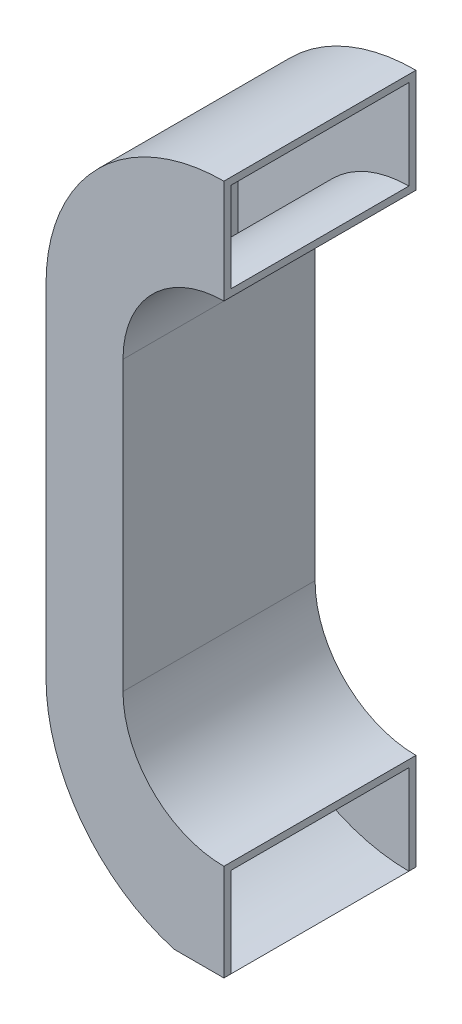
ISO-10303-21;
HEADER;
FILE_DESCRIPTION(('STEP AP214'),'2;1');
FILE_NAME('part.step','',(''),(''),'','','');
FILE_SCHEMA(('AUTOMOTIVE_DESIGN { 1 0 10303 214 1 1 1 1 }'));
ENDSEC;
DATA;
#1=APPLICATION_CONTEXT('core data for automotive mechanical design processes');
#2=APPLICATION_PROTOCOL_DEFINITION('international standard','automotive_design',2000,#1);
#3=PRODUCT_CONTEXT('',#1,'mechanical');
#4=PRODUCT('Part','Part','',(#3));
#5=PRODUCT_RELATED_PRODUCT_CATEGORY('part','',(#4));
#6=PRODUCT_DEFINITION_FORMATION('','',#4);
#7=PRODUCT_DEFINITION_CONTEXT('part definition',#1,'design');
#8=PRODUCT_DEFINITION('design','',#6,#7);
#9=PRODUCT_DEFINITION_SHAPE('','',#8);
#10=(LENGTH_UNIT() NAMED_UNIT(*) SI_UNIT(.MILLI.,.METRE.));
#11=(NAMED_UNIT(*) PLANE_ANGLE_UNIT() SI_UNIT($,.RADIAN.));
#12=(NAMED_UNIT(*) SI_UNIT($,.STERADIAN.) SOLID_ANGLE_UNIT());
#13=UNCERTAINTY_MEASURE_WITH_UNIT(LENGTH_MEASURE(1.E-05),#10,'distance_accuracy_value','');
#14=(GEOMETRIC_REPRESENTATION_CONTEXT(3) GLOBAL_UNCERTAINTY_ASSIGNED_CONTEXT((#13)) GLOBAL_UNIT_ASSIGNED_CONTEXT((#10,
#11,#12)) REPRESENTATION_CONTEXT('',''));
#15=CARTESIAN_POINT('',(0.,0.,0.));
#16=DIRECTION('',(0.,0.,1.));
#17=DIRECTION('',(1.,0.,0.));
#18=AXIS2_PLACEMENT_3D('',#15,#16,#17);
#19=CARTESIAN_POINT('',(0.,88.2,79.375));
#20=DIRECTION('',(0.,0.,1.));
#21=DIRECTION('',(1.,0.,0.));
#22=AXIS2_PLACEMENT_3D('',#19,#20,#21);
#23=PLANE('',#22);
#24=CARTESIAN_POINT('',(0.,216.6,79.375));
#25=DIRECTION('',(0.,0.,1.));
#26=DIRECTION('',(1.,0.,0.));
#27=AXIS2_PLACEMENT_3D('',#24,#25,#26);
#28=CIRCLE('',#27,48.2);
#29=CARTESIAN_POINT('',(0.,264.8,79.375));
#30=VERTEX_POINT('',#29);
#31=CARTESIAN_POINT('',(-48.2,216.6,79.375));
#32=VERTEX_POINT('',#31);
#33=EDGE_CURVE('E217',#30,#32,#28,.T.);
#34=ORIENTED_EDGE('',*,*,#33,.T.);
#35=DIRECTION('',(0.,1.,0.));
#36=VECTOR('',#35,1.);
#37=CARTESIAN_POINT('',(-48.2,0.,79.375));
#38=LINE('',#37,#36);
#39=CARTESIAN_POINT('',(-48.2,88.2,79.375));
#40=VERTEX_POINT('',#39);
#41=EDGE_CURVE('E220',#40,#32,#38,.T.);
#42=ORIENTED_EDGE('',*,*,#41,.F.);
#43=CARTESIAN_POINT('',(0.,88.2,79.375));
#44=DIRECTION('',(0.,0.,1.));
#45=DIRECTION('',(1.,0.,0.));
#46=AXIS2_PLACEMENT_3D('',#43,#44,#45);
#47=CIRCLE('',#46,48.2);
#48=CARTESIAN_POINT('',(0.,40.,79.375));
#49=VERTEX_POINT('',#48);
#50=EDGE_CURVE('E224',#49,#40,#47,.F.);
#51=ORIENTED_EDGE('',*,*,#50,.F.);
#52=DIRECTION('',(0.,1.,0.));
#53=VECTOR('',#52,1.);
#54=CARTESIAN_POINT('',(0.,43.175,79.375));
#55=LINE('',#54,#53);
#56=CARTESIAN_POINT('',(0.,0.,79.375));
#57=VERTEX_POINT('',#56);
#58=EDGE_CURVE('E251',#57,#49,#55,.T.);
#59=ORIENTED_EDGE('',*,*,#58,.F.);
#60=CARTESIAN_POINT('',(0.,76.2,79.375));
#61=DIRECTION('',(0.,0.,1.));
#62=DIRECTION('',(1.,0.,0.));
#63=AXIS2_PLACEMENT_3D('',#60,#61,#62);
#64=CIRCLE('',#63,76.2);
#65=CARTESIAN_POINT('',(-76.2,76.2,79.375));
#66=VERTEX_POINT('',#65);
#67=EDGE_CURVE('E142',#57,#66,#64,.F.);
#68=ORIENTED_EDGE('',*,*,#67,.T.);
#69=DIRECTION('',(0.,1.,0.));
#70=VECTOR('',#69,1.);
#71=CARTESIAN_POINT('',(-76.2,0.,79.375));
#72=LINE('',#71,#70);
#73=CARTESIAN_POINT('',(-76.2,228.6,79.375));
#74=VERTEX_POINT('',#73);
#75=EDGE_CURVE('E100',#66,#74,#72,.T.);
#76=ORIENTED_EDGE('',*,*,#75,.T.);
#77=CARTESIAN_POINT('',(0.,228.6,79.375));
#78=DIRECTION('',(0.,0.,1.));
#79=DIRECTION('',(1.,0.,0.));
#80=AXIS2_PLACEMENT_3D('',#77,#78,#79);
#81=CIRCLE('',#80,76.2);
#82=CARTESIAN_POINT('',(0.,304.8,79.375));
#83=VERTEX_POINT('',#82);
#84=EDGE_CURVE('E124',#83,#74,#81,.T.);
#85=ORIENTED_EDGE('',*,*,#84,.F.);
#86=DIRECTION('',(0.,1.,0.));
#87=VECTOR('',#86,1.);
#88=CARTESIAN_POINT('',(0.,261.625,79.375));
#89=LINE('',#88,#87);
#90=EDGE_CURVE('E246',#30,#83,#89,.T.);
#91=ORIENTED_EDGE('',*,*,#90,.F.);
#92=EDGE_LOOP('',(#34,#42,#51,#59,#68,#76,#85,#91));
#93=FACE_BOUND('',#92,.T.);
#94=ADVANCED_FACE('F84',(#93),#23,.F.);
#95=CARTESIAN_POINT('',(0.,0.,79.375));
#96=DIRECTION('',(-1.,0.,0.));
#97=DIRECTION('',(0.,-1.,0.));
#98=AXIS2_PLACEMENT_3D('',#95,#96,#97);
#99=PLANE('',#98);
#100=DIRECTION('',(0.,-1.,0.));
#101=VECTOR('',#100,1.);
#102=CARTESIAN_POINT('',(0.,307.975,-3.175));
#103=LINE('',#102,#101);
#104=CARTESIAN_POINT('',(0.,307.975,-3.175));
#105=VERTEX_POINT('',#104);
#106=CARTESIAN_POINT('',(0.,261.625,-3.175));
#107=VERTEX_POINT('',#106);
#108=EDGE_CURVE('E191',#105,#107,#103,.T.);
#109=ORIENTED_EDGE('',*,*,#108,.F.);
#110=DIRECTION('',(0.,0.,-1.));
#111=VECTOR('',#110,1.);
#112=CARTESIAN_POINT('',(0.,307.975,79.375));
#113=LINE('',#112,#111);
#114=CARTESIAN_POINT('',(0.,307.975,82.55));
#115=VERTEX_POINT('',#114);
#116=EDGE_CURVE('E12',#115,#105,#113,.T.);
#117=ORIENTED_EDGE('',*,*,#116,.F.);
#118=DIRECTION('',(0.,1.,0.));
#119=VECTOR('',#118,1.);
#120=CARTESIAN_POINT('',(0.,261.625,82.55));
#121=LINE('',#120,#119);
#122=CARTESIAN_POINT('',(0.,261.625,82.55));
#123=VERTEX_POINT('',#122);
#124=EDGE_CURVE('E257',#123,#115,#121,.T.);
#125=ORIENTED_EDGE('',*,*,#124,.F.);
#126=DIRECTION('',(0.,0.,-1.));
#127=VECTOR('',#126,1.);
#128=CARTESIAN_POINT('',(0.,261.625,82.55));
#129=LINE('',#128,#127);
#130=EDGE_CURVE('E282',#123,#107,#129,.T.);
#131=ORIENTED_EDGE('',*,*,#130,.T.);
#132=EDGE_LOOP('',(#109,#117,#125,#131));
#133=FACE_BOUND('',#132,.T.);
#134=DIRECTION('',(0.,0.,-1.));
#135=VECTOR('',#134,1.);
#136=CARTESIAN_POINT('',(0.,304.8,79.375));
#137=LINE('',#136,#135);
#138=CARTESIAN_POINT('',(0.,304.8,0.));
#139=VERTEX_POINT('',#138);
#140=EDGE_CURVE('E127',#83,#139,#137,.T.);
#141=ORIENTED_EDGE('',*,*,#140,.T.);
#142=DIRECTION('',(0.,-1.,0.));
#143=VECTOR('',#142,1.);
#144=CARTESIAN_POINT('',(0.,307.975,0.));
#145=LINE('',#144,#143);
#146=CARTESIAN_POINT('',(0.,264.8,0.));
#147=VERTEX_POINT('',#146);
#148=EDGE_CURVE('E141',#139,#147,#145,.T.);
#149=ORIENTED_EDGE('',*,*,#148,.T.);
#150=DIRECTION('',(0.,0.,-1.));
#151=VECTOR('',#150,1.);
#152=CARTESIAN_POINT('',(0.,264.8,79.375));
#153=LINE('',#152,#151);
#154=EDGE_CURVE('E243',#30,#147,#153,.T.);
#155=ORIENTED_EDGE('',*,*,#154,.F.);
#156=ORIENTED_EDGE('',*,*,#90,.T.);
#157=EDGE_LOOP('',(#141,#149,#155,#156));
#158=FACE_BOUND('',#157,.T.);
#159=ADVANCED_FACE('F86',(#133,#158),#99,.F.);
#160=CARTESIAN_POINT('',(0.,228.6,79.375));
#161=DIRECTION('',(0.,0.,-1.));
#162=DIRECTION('',(-1.,0.,0.));
#163=AXIS2_PLACEMENT_3D('',#160,#161,#162);
#164=CYLINDRICAL_SURFACE('',#163,79.375);
#165=ORIENTED_EDGE('',*,*,#116,.T.);
#166=CARTESIAN_POINT('',(0.,228.6,-3.175));
#167=DIRECTION('',(0.,0.,-1.));
#168=DIRECTION('',(-1.,0.,0.));
#169=AXIS2_PLACEMENT_3D('',#166,#167,#168);
#170=CIRCLE('',#169,79.375);
#171=CARTESIAN_POINT('',(-79.375,228.6,-3.175));
#172=VERTEX_POINT('',#171);
#173=EDGE_CURVE('E182',#172,#105,#170,.T.);
#174=ORIENTED_EDGE('',*,*,#173,.F.);
#175=DIRECTION('',(0.,0.,-1.));
#176=VECTOR('',#175,1.);
#177=CARTESIAN_POINT('',(-79.375,228.6,79.375));
#178=LINE('',#177,#176);
#179=CARTESIAN_POINT('',(-79.375,228.6,82.55));
#180=VERTEX_POINT('',#179);
#181=EDGE_CURVE('E93',#180,#172,#178,.T.);
#182=ORIENTED_EDGE('',*,*,#181,.F.);
#183=CARTESIAN_POINT('',(0.,228.6,82.55));
#184=DIRECTION('',(0.,0.,1.));
#185=DIRECTION('',(1.,0.,0.));
#186=AXIS2_PLACEMENT_3D('',#183,#184,#185);
#187=CIRCLE('',#186,79.375);
#188=EDGE_CURVE('E260',#115,#180,#187,.T.);
#189=ORIENTED_EDGE('',*,*,#188,.F.);
#190=EDGE_LOOP('',(#165,#174,#182,#189));
#191=FACE_BOUND('',#190,.T.);
#192=ADVANCED_FACE('F188',(#191),#164,.T.);
#193=CARTESIAN_POINT('',(-79.375,0.,79.375));
#194=DIRECTION('',(-1.,0.,0.));
#195=DIRECTION('',(0.,0.,1.));
#196=AXIS2_PLACEMENT_3D('',#193,#194,#195);
#197=PLANE('',#196);
#198=ORIENTED_EDGE('',*,*,#181,.T.);
#199=DIRECTION('',(0.,1.,0.));
#200=VECTOR('',#199,1.);
#201=CARTESIAN_POINT('',(-79.375,76.2,-3.175));
#202=LINE('',#201,#200);
#203=CARTESIAN_POINT('',(-79.375,76.2,-3.175));
#204=VERTEX_POINT('',#203);
#205=EDGE_CURVE('E166',#204,#172,#202,.T.);
#206=ORIENTED_EDGE('',*,*,#205,.F.);
#207=DIRECTION('',(0.,0.,-1.));
#208=VECTOR('',#207,1.);
#209=CARTESIAN_POINT('',(-79.375,76.2,79.375));
#210=LINE('',#209,#208);
#211=CARTESIAN_POINT('',(-79.375,76.2,82.55));
#212=VERTEX_POINT('',#211);
#213=EDGE_CURVE('E154',#212,#204,#210,.T.);
#214=ORIENTED_EDGE('',*,*,#213,.F.);
#215=DIRECTION('',(0.,-1.,0.));
#216=VECTOR('',#215,1.);
#217=CARTESIAN_POINT('',(-79.375,228.6,82.55));
#218=LINE('',#217,#216);
#219=EDGE_CURVE('E169',#180,#212,#218,.T.);
#220=ORIENTED_EDGE('',*,*,#219,.F.);
#221=EDGE_LOOP('',(#198,#206,#214,#220));
#222=FACE_BOUND('',#221,.T.);
#223=ADVANCED_FACE('F163',(#222),#197,.T.);
#224=CARTESIAN_POINT('',(0.,76.2,79.375));
#225=DIRECTION('',(0.,0.,-1.));
#226=DIRECTION('',(-1.,0.,0.));
#227=AXIS2_PLACEMENT_3D('',#224,#225,#226);
#228=CYLINDRICAL_SURFACE('',#227,79.375);
#229=ORIENTED_EDGE('',*,*,#213,.T.);
#230=CARTESIAN_POINT('',(0.,76.2,-3.175));
#231=DIRECTION('',(0.,0.,-1.));
#232=DIRECTION('',(-1.,0.,0.));
#233=AXIS2_PLACEMENT_3D('',#230,#231,#232);
#234=CIRCLE('',#233,79.375);
#235=CARTESIAN_POINT('',(-22.225,0.,-3.175));
#236=VERTEX_POINT('',#235);
#237=EDGE_CURVE('E185',#236,#204,#234,.T.);
#238=ORIENTED_EDGE('',*,*,#237,.F.);
#239=DIRECTION('',(0.,0.,-1.));
#240=VECTOR('',#239,1.);
#241=CARTESIAN_POINT('',(-22.225,0.,79.375));
#242=LINE('',#241,#240);
#243=CARTESIAN_POINT('',(-22.225,0.,82.55));
#244=VERTEX_POINT('',#243);
#245=EDGE_CURVE('E151',#244,#236,#242,.T.);
#246=ORIENTED_EDGE('',*,*,#245,.F.);
#247=CARTESIAN_POINT('',(0.,76.2,82.55));
#248=DIRECTION('',(0.,0.,1.));
#249=DIRECTION('',(1.,0.,0.));
#250=AXIS2_PLACEMENT_3D('',#247,#248,#249);
#251=CIRCLE('',#250,79.375);
#252=EDGE_CURVE('E263',#212,#244,#251,.T.);
#253=ORIENTED_EDGE('',*,*,#252,.F.);
#254=EDGE_LOOP('',(#229,#238,#246,#253));
#255=FACE_BOUND('',#254,.T.);
#256=ADVANCED_FACE('F315',(#255),#228,.T.);
#257=CARTESIAN_POINT('',(0.,0.,79.375));
#258=DIRECTION('',(0.,-1.,0.));
#259=DIRECTION('',(0.,0.,-1.));
#260=AXIS2_PLACEMENT_3D('',#257,#258,#259);
#261=PLANE('',#260);
#262=ORIENTED_EDGE('',*,*,#245,.T.);
#263=DIRECTION('',(-1.,0.,0.));
#264=VECTOR('',#263,1.);
#265=CARTESIAN_POINT('',(0.,0.,-3.175));
#266=LINE('',#265,#264);
#267=CARTESIAN_POINT('',(0.,0.,-3.175));
#268=VERTEX_POINT('',#267);
#269=EDGE_CURVE('E210',#268,#236,#266,.T.);
#270=ORIENTED_EDGE('',*,*,#269,.F.);
#271=DIRECTION('',(0.,0.,1.));
#272=VECTOR('',#271,1.);
#273=CARTESIAN_POINT('',(0.,0.,-3.175));
#274=LINE('',#273,#272);
#275=CARTESIAN_POINT('',(0.,0.,0.));
#276=VERTEX_POINT('',#275);
#277=EDGE_CURVE('E186',#268,#276,#274,.T.);
#278=ORIENTED_EDGE('',*,*,#277,.T.);
#279=DIRECTION('',(0.,0.,-1.));
#280=VECTOR('',#279,1.);
#281=CARTESIAN_POINT('',(0.,0.,79.375));
#282=LINE('',#281,#280);
#283=EDGE_CURVE('E149',#57,#276,#282,.T.);
#284=ORIENTED_EDGE('',*,*,#283,.F.);
#285=DIRECTION('',(0.,0.,-1.));
#286=VECTOR('',#285,1.);
#287=CARTESIAN_POINT('',(0.,0.,82.55));
#288=LINE('',#287,#286);
#289=CARTESIAN_POINT('',(0.,0.,82.55));
#290=VERTEX_POINT('',#289);
#291=EDGE_CURVE('E279',#290,#57,#288,.T.);
#292=ORIENTED_EDGE('',*,*,#291,.F.);
#293=DIRECTION('',(1.,0.,0.));
#294=VECTOR('',#293,1.);
#295=CARTESIAN_POINT('',(0.,0.,82.55));
#296=LINE('',#295,#294);
#297=EDGE_CURVE('E266',#244,#290,#296,.T.);
#298=ORIENTED_EDGE('',*,*,#297,.F.);
#299=EDGE_LOOP('',(#262,#270,#278,#284,#292,#298));
#300=FACE_BOUND('',#299,.T.);
#301=ADVANCED_FACE('F305',(#300),#261,.T.);
#302=CARTESIAN_POINT('',(0.,76.2,79.375));
#303=DIRECTION('',(0.,0.,-1.));
#304=DIRECTION('',(-1.,0.,0.));
#305=AXIS2_PLACEMENT_3D('',#302,#303,#304);
#306=CYLINDRICAL_SURFACE('',#305,76.2);
#307=CARTESIAN_POINT('',(0.,76.2,0.));
#308=DIRECTION('',(0.,0.,1.));
#309=DIRECTION('',(1.,0.,0.));
#310=AXIS2_PLACEMENT_3D('',#307,#308,#309);
#311=CIRCLE('',#310,76.2);
#312=CARTESIAN_POINT('',(-76.2,76.2,0.));
#313=VERTEX_POINT('',#312);
#314=EDGE_CURVE('E136',#276,#313,#311,.F.);
#315=ORIENTED_EDGE('',*,*,#314,.T.);
#316=DIRECTION('',(0.,0.,-1.));
#317=VECTOR('',#316,1.);
#318=CARTESIAN_POINT('',(-76.2,76.2,79.375));
#319=LINE('',#318,#317);
#320=EDGE_CURVE('E126',#66,#313,#319,.T.);
#321=ORIENTED_EDGE('',*,*,#320,.F.);
#322=ORIENTED_EDGE('',*,*,#67,.F.);
#323=ORIENTED_EDGE('',*,*,#283,.T.);
#324=EDGE_LOOP('',(#315,#321,#322,#323));
#325=FACE_BOUND('',#324,.T.);
#326=ADVANCED_FACE('F293',(#325),#306,.F.);
#327=CARTESIAN_POINT('',(-76.2,0.,79.375));
#328=DIRECTION('',(-1.,0.,0.));
#329=DIRECTION('',(0.,0.,1.));
#330=AXIS2_PLACEMENT_3D('',#327,#328,#329);
#331=PLANE('',#330);
#332=DIRECTION('',(0.,1.,0.));
#333=VECTOR('',#332,1.);
#334=CARTESIAN_POINT('',(-76.2,0.,0.));
#335=LINE('',#334,#333);
#336=CARTESIAN_POINT('',(-76.2,228.6,0.));
#337=VERTEX_POINT('',#336);
#338=EDGE_CURVE('E131',#313,#337,#335,.T.);
#339=ORIENTED_EDGE('',*,*,#338,.T.);
#340=DIRECTION('',(0.,0.,-1.));
#341=VECTOR('',#340,1.);
#342=CARTESIAN_POINT('',(-76.2,228.6,79.375));
#343=LINE('',#342,#341);
#344=EDGE_CURVE('E117',#74,#337,#343,.T.);
#345=ORIENTED_EDGE('',*,*,#344,.F.);
#346=ORIENTED_EDGE('',*,*,#75,.F.);
#347=ORIENTED_EDGE('',*,*,#320,.T.);
#348=EDGE_LOOP('',(#339,#345,#346,#347));
#349=FACE_BOUND('',#348,.T.);
#350=ADVANCED_FACE('F132',(#349),#331,.F.);
#351=CARTESIAN_POINT('',(0.,228.6,79.375));
#352=DIRECTION('',(0.,0.,-1.));
#353=DIRECTION('',(-1.,0.,0.));
#354=AXIS2_PLACEMENT_3D('',#351,#352,#353);
#355=CYLINDRICAL_SURFACE('',#354,76.2);
#356=CARTESIAN_POINT('',(0.,228.6,0.));
#357=DIRECTION('',(0.,0.,1.));
#358=DIRECTION('',(1.,0.,0.));
#359=AXIS2_PLACEMENT_3D('',#356,#357,#358);
#360=CIRCLE('',#359,76.2);
#361=EDGE_CURVE('E122',#139,#337,#360,.T.);
#362=ORIENTED_EDGE('',*,*,#361,.F.);
#363=ORIENTED_EDGE('',*,*,#140,.F.);
#364=ORIENTED_EDGE('',*,*,#84,.T.);
#365=ORIENTED_EDGE('',*,*,#344,.T.);
#366=EDGE_LOOP('',(#362,#363,#364,#365));
#367=FACE_BOUND('',#366,.T.);
#368=ADVANCED_FACE('F119',(#367),#355,.F.);
#369=CARTESIAN_POINT('',(0.,88.2,82.55));
#370=DIRECTION('',(0.,0.,-1.));
#371=DIRECTION('',(-1.,0.,0.));
#372=AXIS2_PLACEMENT_3D('',#369,#370,#371);
#373=CYLINDRICAL_SURFACE('',#372,45.025);
#374=DIRECTION('',(0.,0.,-1.));
#375=VECTOR('',#374,1.);
#376=CARTESIAN_POINT('',(0.,43.175,82.55));
#377=LINE('',#376,#375);
#378=CARTESIAN_POINT('',(0.,43.175,82.55));
#379=VERTEX_POINT('',#378);
#380=CARTESIAN_POINT('',(0.,43.175,-3.175));
#381=VERTEX_POINT('',#380);
#382=EDGE_CURVE('E272',#379,#381,#377,.T.);
#383=ORIENTED_EDGE('',*,*,#382,.T.);
#384=CARTESIAN_POINT('',(0.,88.2,-3.175));
#385=DIRECTION('',(0.,0.,1.));
#386=DIRECTION('',(-1.,0.,0.));
#387=AXIS2_PLACEMENT_3D('',#384,#385,#386);
#388=CIRCLE('',#387,45.025);
#389=CARTESIAN_POINT('',(-45.025,88.2,-3.175));
#390=VERTEX_POINT('',#389);
#391=EDGE_CURVE('E204',#390,#381,#388,.T.);
#392=ORIENTED_EDGE('',*,*,#391,.F.);
#393=DIRECTION('',(0.,0.,-1.));
#394=VECTOR('',#393,1.);
#395=CARTESIAN_POINT('',(-45.025,88.2,82.55));
#396=LINE('',#395,#394);
#397=CARTESIAN_POINT('',(-45.025,88.2,82.55));
#398=VERTEX_POINT('',#397);
#399=EDGE_CURVE('E288',#398,#390,#396,.T.);
#400=ORIENTED_EDGE('',*,*,#399,.F.);
#401=CARTESIAN_POINT('',(0.,88.2,82.55));
#402=DIRECTION('',(0.,0.,-1.));
#403=DIRECTION('',(1.,0.,0.));
#404=AXIS2_PLACEMENT_3D('',#401,#402,#403);
#405=CIRCLE('',#404,45.025);
#406=EDGE_CURVE('E247',#379,#398,#405,.T.);
#407=ORIENTED_EDGE('',*,*,#406,.F.);
#408=EDGE_LOOP('',(#383,#392,#400,#407));
#409=FACE_BOUND('',#408,.T.);
#410=ADVANCED_FACE('F393',(#409),#373,.F.);
#411=CARTESIAN_POINT('',(-45.025,88.2,82.55));
#412=DIRECTION('',(-1.,0.,0.));
#413=DIRECTION('',(0.,0.,1.));
#414=AXIS2_PLACEMENT_3D('',#411,#412,#413);
#415=PLANE('',#414);
#416=ORIENTED_EDGE('',*,*,#399,.T.);
#417=DIRECTION('',(0.,-1.,0.));
#418=VECTOR('',#417,1.);
#419=CARTESIAN_POINT('',(-45.025,216.6,-3.175));
#420=LINE('',#419,#418);
#421=CARTESIAN_POINT('',(-45.025,216.6,-3.175));
#422=VERTEX_POINT('',#421);
#423=EDGE_CURVE('E201',#422,#390,#420,.T.);
#424=ORIENTED_EDGE('',*,*,#423,.F.);
#425=DIRECTION('',(0.,0.,-1.));
#426=VECTOR('',#425,1.);
#427=CARTESIAN_POINT('',(-45.025,216.6,82.55));
#428=LINE('',#427,#426);
#429=CARTESIAN_POINT('',(-45.025,216.6,82.55));
#430=VERTEX_POINT('',#429);
#431=EDGE_CURVE('E285',#430,#422,#428,.T.);
#432=ORIENTED_EDGE('',*,*,#431,.F.);
#433=DIRECTION('',(0.,1.,0.));
#434=VECTOR('',#433,1.);
#435=CARTESIAN_POINT('',(-45.025,88.2,82.55));
#436=LINE('',#435,#434);
#437=EDGE_CURVE('E250',#398,#430,#436,.T.);
#438=ORIENTED_EDGE('',*,*,#437,.F.);
#439=EDGE_LOOP('',(#416,#424,#432,#438));
#440=FACE_BOUND('',#439,.T.);
#441=ADVANCED_FACE('F372',(#440),#415,.F.);
#442=CARTESIAN_POINT('',(0.,216.6,82.55));
#443=DIRECTION('',(0.,0.,-1.));
#444=DIRECTION('',(-1.,0.,0.));
#445=AXIS2_PLACEMENT_3D('',#442,#443,#444);
#446=CYLINDRICAL_SURFACE('',#445,45.025);
#447=ORIENTED_EDGE('',*,*,#431,.T.);
#448=CARTESIAN_POINT('',(0.,216.6,-3.175));
#449=DIRECTION('',(0.,0.,1.));
#450=DIRECTION('',(-1.,0.,0.));
#451=AXIS2_PLACEMENT_3D('',#448,#449,#450);
#452=CIRCLE('',#451,45.025);
#453=EDGE_CURVE('E194',#107,#422,#452,.T.);
#454=ORIENTED_EDGE('',*,*,#453,.F.);
#455=ORIENTED_EDGE('',*,*,#130,.F.);
#456=CARTESIAN_POINT('',(0.,216.6,82.55));
#457=DIRECTION('',(0.,0.,-1.));
#458=DIRECTION('',(1.,0.,0.));
#459=AXIS2_PLACEMENT_3D('',#456,#457,#458);
#460=CIRCLE('',#459,45.025);
#461=EDGE_CURVE('E254',#430,#123,#460,.T.);
#462=ORIENTED_EDGE('',*,*,#461,.F.);
#463=EDGE_LOOP('',(#447,#454,#455,#462));
#464=FACE_BOUND('',#463,.T.);
#465=ADVANCED_FACE('F376',(#464),#446,.F.);
#466=CARTESIAN_POINT('',(0.,43.175,82.55));
#467=DIRECTION('',(-1.,0.,0.));
#468=DIRECTION('',(0.,0.,1.));
#469=AXIS2_PLACEMENT_3D('',#466,#467,#468);
#470=PLANE('',#469);
#471=ORIENTED_EDGE('',*,*,#58,.T.);
#472=DIRECTION('',(0.,0.,-1.));
#473=VECTOR('',#472,1.);
#474=CARTESIAN_POINT('',(0.,40.,79.375));
#475=LINE('',#474,#473);
#476=CARTESIAN_POINT('',(0.,40.,0.));
#477=VERTEX_POINT('',#476);
#478=EDGE_CURVE('E227',#49,#477,#475,.T.);
#479=ORIENTED_EDGE('',*,*,#478,.T.);
#480=DIRECTION('',(0.,-1.,0.));
#481=VECTOR('',#480,1.);
#482=CARTESIAN_POINT('',(0.,43.175,0.));
#483=LINE('',#482,#481);
#484=EDGE_CURVE('E192',#477,#276,#483,.T.);
#485=ORIENTED_EDGE('',*,*,#484,.T.);
#486=ORIENTED_EDGE('',*,*,#277,.F.);
#487=DIRECTION('',(0.,-1.,0.));
#488=VECTOR('',#487,1.);
#489=CARTESIAN_POINT('',(0.,43.175,-3.175));
#490=LINE('',#489,#488);
#491=EDGE_CURVE('E207',#381,#268,#490,.T.);
#492=ORIENTED_EDGE('',*,*,#491,.F.);
#493=ORIENTED_EDGE('',*,*,#382,.F.);
#494=DIRECTION('',(0.,1.,0.));
#495=VECTOR('',#494,1.);
#496=CARTESIAN_POINT('',(0.,43.175,82.55));
#497=LINE('',#496,#495);
#498=EDGE_CURVE('E269',#290,#379,#497,.T.);
#499=ORIENTED_EDGE('',*,*,#498,.F.);
#500=ORIENTED_EDGE('',*,*,#291,.T.);
#501=EDGE_LOOP('',(#471,#479,#485,#486,#492,#493,#499,#500));
#502=FACE_BOUND('',#501,.T.);
#503=ADVANCED_FACE('F299',(#502),#470,.F.);
#504=CARTESIAN_POINT('',(0.,88.2,82.55));
#505=DIRECTION('',(0.,0.,1.));
#506=DIRECTION('',(1.,0.,0.));
#507=AXIS2_PLACEMENT_3D('',#504,#505,#506);
#508=PLANE('',#507);
#509=ORIENTED_EDGE('',*,*,#406,.T.);
#510=ORIENTED_EDGE('',*,*,#437,.T.);
#511=ORIENTED_EDGE('',*,*,#461,.T.);
#512=ORIENTED_EDGE('',*,*,#124,.T.);
#513=ORIENTED_EDGE('',*,*,#188,.T.);
#514=ORIENTED_EDGE('',*,*,#219,.T.);
#515=ORIENTED_EDGE('',*,*,#252,.T.);
#516=ORIENTED_EDGE('',*,*,#297,.T.);
#517=ORIENTED_EDGE('',*,*,#498,.T.);
#518=EDGE_LOOP('',(#509,#510,#511,#512,#513,#514,#515,#516,#517));
#519=FACE_BOUND('',#518,.T.);
#520=ADVANCED_FACE('F322',(#519),#508,.T.);
#521=CARTESIAN_POINT('',(0.,216.6,79.375));
#522=DIRECTION('',(0.,0.,-1.));
#523=DIRECTION('',(-1.,0.,0.));
#524=AXIS2_PLACEMENT_3D('',#521,#522,#523);
#525=CYLINDRICAL_SURFACE('',#524,48.2);
#526=CARTESIAN_POINT('',(0.,216.6,0.));
#527=DIRECTION('',(0.,0.,1.));
#528=DIRECTION('',(1.,0.,0.));
#529=AXIS2_PLACEMENT_3D('',#526,#527,#528);
#530=CIRCLE('',#529,48.2);
#531=CARTESIAN_POINT('',(-48.2,216.6,0.));
#532=VERTEX_POINT('',#531);
#533=EDGE_CURVE('E216',#147,#532,#530,.T.);
#534=ORIENTED_EDGE('',*,*,#533,.T.);
#535=DIRECTION('',(0.,0.,-1.));
#536=VECTOR('',#535,1.);
#537=CARTESIAN_POINT('',(-48.2,216.6,79.375));
#538=LINE('',#537,#536);
#539=EDGE_CURVE('E240',#32,#532,#538,.T.);
#540=ORIENTED_EDGE('',*,*,#539,.F.);
#541=ORIENTED_EDGE('',*,*,#33,.F.);
#542=ORIENTED_EDGE('',*,*,#154,.T.);
#543=EDGE_LOOP('',(#534,#540,#541,#542));
#544=FACE_BOUND('',#543,.T.);
#545=ADVANCED_FACE('F383',(#544),#525,.T.);
#546=CARTESIAN_POINT('',(-48.2,0.,79.375));
#547=DIRECTION('',(-1.,0.,0.));
#548=DIRECTION('',(0.,0.,1.));
#549=AXIS2_PLACEMENT_3D('',#546,#547,#548);
#550=PLANE('',#549);
#551=DIRECTION('',(0.,1.,0.));
#552=VECTOR('',#551,1.);
#553=CARTESIAN_POINT('',(-48.2,0.,0.));
#554=LINE('',#553,#552);
#555=CARTESIAN_POINT('',(-48.2,88.2,0.));
#556=VERTEX_POINT('',#555);
#557=EDGE_CURVE('E230',#556,#532,#554,.T.);
#558=ORIENTED_EDGE('',*,*,#557,.F.);
#559=DIRECTION('',(0.,0.,-1.));
#560=VECTOR('',#559,1.);
#561=CARTESIAN_POINT('',(-48.2,88.2,79.375));
#562=LINE('',#561,#560);
#563=EDGE_CURVE('E237',#40,#556,#562,.T.);
#564=ORIENTED_EDGE('',*,*,#563,.F.);
#565=ORIENTED_EDGE('',*,*,#41,.T.);
#566=ORIENTED_EDGE('',*,*,#539,.T.);
#567=EDGE_LOOP('',(#558,#564,#565,#566));
#568=FACE_BOUND('',#567,.T.);
#569=ADVANCED_FACE('F433',(#568),#550,.T.);
#570=CARTESIAN_POINT('',(0.,88.2,79.375));
#571=DIRECTION('',(0.,0.,-1.));
#572=DIRECTION('',(-1.,0.,0.));
#573=AXIS2_PLACEMENT_3D('',#570,#571,#572);
#574=CYLINDRICAL_SURFACE('',#573,48.2);
#575=CARTESIAN_POINT('',(0.,88.2,0.));
#576=DIRECTION('',(0.,0.,1.));
#577=DIRECTION('',(1.,0.,0.));
#578=AXIS2_PLACEMENT_3D('',#575,#576,#577);
#579=CIRCLE('',#578,48.2);
#580=EDGE_CURVE('E221',#477,#556,#579,.F.);
#581=ORIENTED_EDGE('',*,*,#580,.F.);
#582=ORIENTED_EDGE('',*,*,#478,.F.);
#583=ORIENTED_EDGE('',*,*,#50,.T.);
#584=ORIENTED_EDGE('',*,*,#563,.T.);
#585=EDGE_LOOP('',(#581,#582,#583,#584));
#586=FACE_BOUND('',#585,.T.);
#587=ADVANCED_FACE('F439',(#586),#574,.T.);
#588=CARTESIAN_POINT('',(0.,228.6,0.));
#589=DIRECTION('',(0.,0.,-1.));
#590=DIRECTION('',(-1.,0.,0.));
#591=AXIS2_PLACEMENT_3D('',#588,#589,#590);
#592=PLANE('',#591);
#593=ORIENTED_EDGE('',*,*,#338,.F.);
#594=ORIENTED_EDGE('',*,*,#314,.F.);
#595=ORIENTED_EDGE('',*,*,#484,.F.);
#596=ORIENTED_EDGE('',*,*,#580,.T.);
#597=ORIENTED_EDGE('',*,*,#557,.T.);
#598=ORIENTED_EDGE('',*,*,#533,.F.);
#599=ORIENTED_EDGE('',*,*,#148,.F.);
#600=ORIENTED_EDGE('',*,*,#361,.T.);
#601=EDGE_LOOP('',(#593,#594,#595,#596,#597,#598,#599,#600));
#602=FACE_BOUND('',#601,.T.);
#603=ADVANCED_FACE('F138',(#602),#592,.F.);
#604=CARTESIAN_POINT('',(0.,228.6,-3.175));
#605=DIRECTION('',(0.,0.,-1.));
#606=DIRECTION('',(-1.,0.,0.));
#607=AXIS2_PLACEMENT_3D('',#604,#605,#606);
#608=PLANE('',#607);
#609=ORIENTED_EDGE('',*,*,#173,.T.);
#610=ORIENTED_EDGE('',*,*,#108,.T.);
#611=ORIENTED_EDGE('',*,*,#453,.T.);
#612=ORIENTED_EDGE('',*,*,#423,.T.);
#613=ORIENTED_EDGE('',*,*,#391,.T.);
#614=ORIENTED_EDGE('',*,*,#491,.T.);
#615=ORIENTED_EDGE('',*,*,#269,.T.);
#616=ORIENTED_EDGE('',*,*,#237,.T.);
#617=ORIENTED_EDGE('',*,*,#205,.T.);
#618=EDGE_LOOP('',(#609,#610,#611,#612,#613,#614,#615,#616,#617));
#619=FACE_BOUND('',#618,.T.);
#620=ADVANCED_FACE('F179',(#619),#608,.T.);
#621=CLOSED_SHELL('',(#94,#159,#192,#223,#256,#301,#326,#350,#368,#410,#441,#465,#503,#520,#545,
#569,#587,#603,#620));
#622=MANIFOLD_SOLID_BREP('B2',#621);
#623=ADVANCED_BREP_SHAPE_REPRESENTATION('',(#18,#622),#14);
#624=SHAPE_DEFINITION_REPRESENTATION(#9,#623);
ENDSEC;
END-ISO-10303-21;
